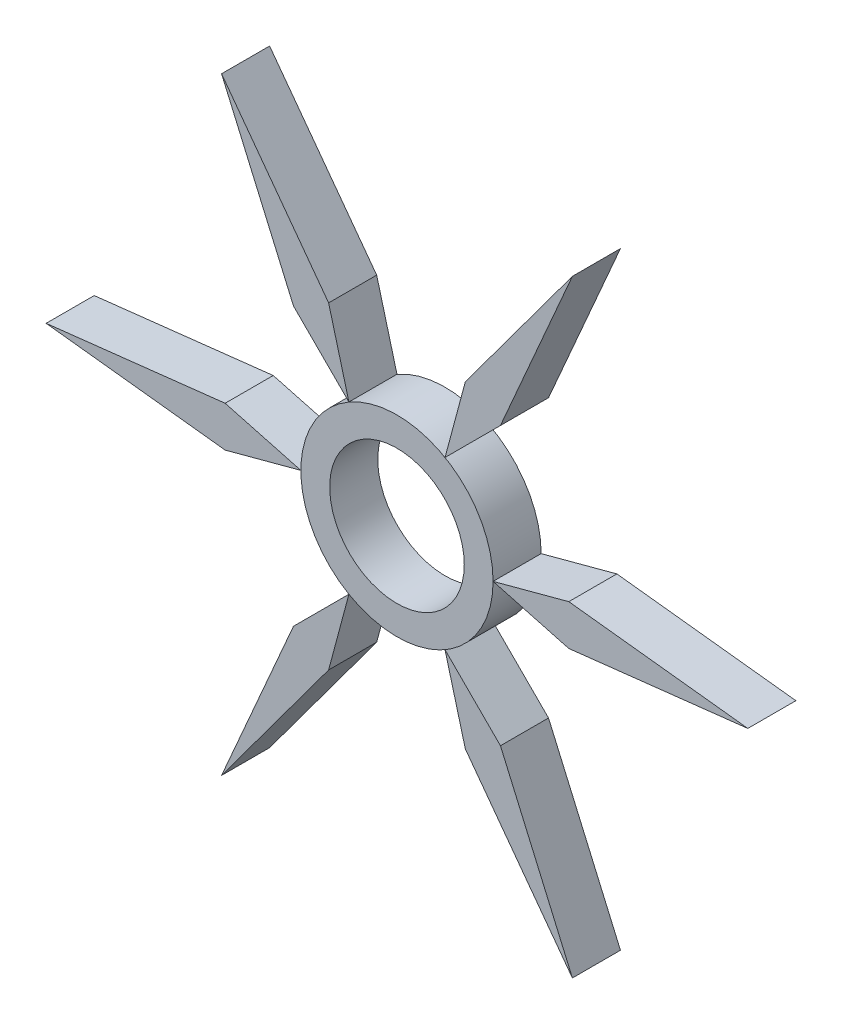
ISO-10303-21;
HEADER;
FILE_DESCRIPTION(('STEP AP214'),'2;1');
FILE_NAME('part.step','',(''),(''),'','','');
FILE_SCHEMA(('AUTOMOTIVE_DESIGN { 1 0 10303 214 1 1 1 1 }'));
ENDSEC;
DATA;
#1=APPLICATION_CONTEXT('core data for automotive mechanical design processes');
#2=APPLICATION_PROTOCOL_DEFINITION('international standard','automotive_design',2000,#1);
#3=PRODUCT_CONTEXT('',#1,'mechanical');
#4=PRODUCT('Part','Part','',(#3));
#5=PRODUCT_RELATED_PRODUCT_CATEGORY('part','',(#4));
#6=PRODUCT_DEFINITION_FORMATION('','',#4);
#7=PRODUCT_DEFINITION_CONTEXT('part definition',#1,'design');
#8=PRODUCT_DEFINITION('design','',#6,#7);
#9=PRODUCT_DEFINITION_SHAPE('','',#8);
#10=(LENGTH_UNIT() NAMED_UNIT(*) SI_UNIT(.MILLI.,.METRE.));
#11=(NAMED_UNIT(*) PLANE_ANGLE_UNIT() SI_UNIT($,.RADIAN.));
#12=(NAMED_UNIT(*) SI_UNIT($,.STERADIAN.) SOLID_ANGLE_UNIT());
#13=UNCERTAINTY_MEASURE_WITH_UNIT(LENGTH_MEASURE(1.E-05),#10,'distance_accuracy_value','');
#14=(GEOMETRIC_REPRESENTATION_CONTEXT(3) GLOBAL_UNCERTAINTY_ASSIGNED_CONTEXT((#13)) GLOBAL_UNIT_ASSIGNED_CONTEXT((#10,
#11,#12)) REPRESENTATION_CONTEXT('',''));
#15=CARTESIAN_POINT('',(0.,0.,0.));
#16=DIRECTION('',(0.,0.,1.));
#17=DIRECTION('',(1.,0.,0.));
#18=AXIS2_PLACEMENT_3D('',#15,#16,#17);
#19=CARTESIAN_POINT('',(-5.00000000000001,1.33974596215564,5.));
#20=DIRECTION('',(0.965925826289067,-0.258819045102524,0.));
#21=DIRECTION('',(0.258819045102524,0.965925826289067,0.));
#22=AXIS2_PLACEMENT_3D('',#19,#20,#21);
#23=PLANE('',#22);
#24=DIRECTION('',(-0.258819045102524,-0.965925826289067,0.));
#25=VECTOR('',#24,1.);
#26=CARTESIAN_POINT('',(-5.00000000000001,1.33974596215564,-5.));
#27=LINE('',#26,#25);
#28=CARTESIAN_POINT('',(-10.0000000000001,-17.3205080756887,-5.));
#29=VERTEX_POINT('',#28);
#30=CARTESIAN_POINT('',(-14.2206626174356,-33.0722354055644,-5.));
#31=VERTEX_POINT('',#30);
#32=EDGE_CURVE('E13',#29,#31,#27,.T.);
#33=ORIENTED_EDGE('',*,*,#32,.F.);
#34=DIRECTION('',(0.,0.,-1.));
#35=VECTOR('',#34,1.);
#36=CARTESIAN_POINT('',(-10.0000000000001,-17.3205080756887,5.));
#37=LINE('',#36,#35);
#38=CARTESIAN_POINT('',(-10.0000000000001,-17.3205080756887,5.));
#39=VERTEX_POINT('',#38);
#40=EDGE_CURVE('E133',#39,#29,#37,.T.);
#41=ORIENTED_EDGE('',*,*,#40,.F.);
#42=DIRECTION('',(-0.258819045102524,-0.965925826289067,0.));
#43=VECTOR('',#42,1.);
#44=CARTESIAN_POINT('',(-5.00000000000001,1.33974596215564,5.));
#45=LINE('',#44,#43);
#46=CARTESIAN_POINT('',(-14.2206626174356,-33.0722354055644,5.));
#47=VERTEX_POINT('',#46);
#48=EDGE_CURVE('E191',#39,#47,#45,.T.);
#49=ORIENTED_EDGE('',*,*,#48,.T.);
#50=DIRECTION('',(0.,0.,-1.));
#51=VECTOR('',#50,1.);
#52=CARTESIAN_POINT('',(-14.2206626174356,-33.0722354055644,5.));
#53=LINE('',#52,#51);
#54=EDGE_CURVE('E173',#47,#31,#53,.T.);
#55=ORIENTED_EDGE('',*,*,#54,.T.);
#56=EDGE_LOOP('',(#33,#41,#49,#55));
#57=FACE_BOUND('',#56,.T.);
#58=ADVANCED_FACE('F129',(#57),#23,.T.);
#59=CARTESIAN_POINT('',(3.66025403784438,-3.66025403784442,5.));
#60=DIRECTION('',(0.707106781186544,-0.707106781186552,0.));
#61=DIRECTION('',(0.707106781186551,0.707106781186544,0.));
#62=AXIS2_PLACEMENT_3D('',#59,#60,#61);
#63=PLANE('',#62);
#64=DIRECTION('',(-0.707106781186552,-0.707106781186544,0.));
#65=VECTOR('',#64,1.);
#66=CARTESIAN_POINT('',(3.66025403784438,-3.66025403784442,-5.));
#67=LINE('',#66,#65);
#68=CARTESIAN_POINT('',(-21.5310647124404,-28.851572788129,-5.));
#69=VERTEX_POINT('',#68);
#70=EDGE_CURVE('E139',#29,#69,#67,.T.);
#71=ORIENTED_EDGE('',*,*,#70,.T.);
#72=DIRECTION('',(0.,0.,-1.));
#73=VECTOR('',#72,1.);
#74=CARTESIAN_POINT('',(-21.5310647124404,-28.851572788129,5.));
#75=LINE('',#74,#73);
#76=CARTESIAN_POINT('',(-21.5310647124404,-28.851572788129,5.));
#77=VERTEX_POINT('',#76);
#78=EDGE_CURVE('E171',#77,#69,#75,.T.);
#79=ORIENTED_EDGE('',*,*,#78,.F.);
#80=DIRECTION('',(-0.707106781186552,-0.707106781186544,0.));
#81=VECTOR('',#80,1.);
#82=CARTESIAN_POINT('',(3.66025403784438,-3.66025403784442,5.));
#83=LINE('',#82,#81);
#84=EDGE_CURVE('E170',#39,#77,#83,.T.);
#85=ORIENTED_EDGE('',*,*,#84,.F.);
#86=ORIENTED_EDGE('',*,*,#40,.T.);
#87=EDGE_LOOP('',(#71,#79,#85,#86));
#88=FACE_BOUND('',#87,.T.);
#89=ADVANCED_FACE('F169',(#88),#63,.F.);
#90=CARTESIAN_POINT('',(-7.53543625072196,3.28202202903648,5.));
#91=DIRECTION('',(0.916814262260015,-0.399313922267461,0.));
#92=DIRECTION('',(0.399313922267461,0.916814262260015,0.));
#93=AXIS2_PLACEMENT_3D('',#90,#91,#92);
#94=PLANE('',#93);
#95=DIRECTION('',(-0.399313922267461,-0.916814262260015,0.));
#96=VECTOR('',#95,1.);
#97=CARTESIAN_POINT('',(-7.53543625072196,3.28202202903648,-5.));
#98=LINE('',#97,#96);
#99=CARTESIAN_POINT('',(-36.5000000000003,-63.2198544762639,-5.));
#100=VERTEX_POINT('',#99);
#101=EDGE_CURVE('E180',#69,#100,#98,.T.);
#102=ORIENTED_EDGE('',*,*,#101,.T.);
#103=DIRECTION('',(0.,0.,-1.));
#104=VECTOR('',#103,1.);
#105=CARTESIAN_POINT('',(-36.5000000000003,-63.2198544762639,5.));
#106=LINE('',#105,#104);
#107=CARTESIAN_POINT('',(-36.5000000000003,-63.2198544762639,5.));
#108=VERTEX_POINT('',#107);
#109=EDGE_CURVE('E195',#108,#100,#106,.T.);
#110=ORIENTED_EDGE('',*,*,#109,.F.);
#111=DIRECTION('',(-0.399313922267461,-0.916814262260015,0.));
#112=VECTOR('',#111,1.);
#113=CARTESIAN_POINT('',(-7.53543625072196,3.28202202903648,5.));
#114=LINE('',#113,#112);
#115=EDGE_CURVE('E189',#77,#108,#114,.T.);
#116=ORIENTED_EDGE('',*,*,#115,.F.);
#117=ORIENTED_EDGE('',*,*,#78,.T.);
#118=EDGE_LOOP('',(#102,#110,#116,#117));
#119=FACE_BOUND('',#118,.T.);
#120=ADVANCED_FACE('F199',(#119),#94,.F.);
#121=CARTESIAN_POINT('',(6.61003257828668,-4.88486820720521,5.));
#122=DIRECTION('',(0.804223131898428,-0.594327480535339,0.));
#123=DIRECTION('',(0.594327480535339,0.804223131898428,0.));
#124=AXIS2_PLACEMENT_3D('',#121,#122,#123);
#125=PLANE('',#124);
#126=DIRECTION('',(-0.594327480535339,-0.804223131898428,0.));
#127=VECTOR('',#126,1.);
#128=CARTESIAN_POINT('',(6.61003257828668,-4.88486820720521,-5.));
#129=LINE('',#128,#127);
#130=EDGE_CURVE('E182',#31,#100,#129,.T.);
#131=ORIENTED_EDGE('',*,*,#130,.F.);
#132=ORIENTED_EDGE('',*,*,#54,.F.);
#133=DIRECTION('',(-0.594327480535339,-0.804223131898428,0.));
#134=VECTOR('',#133,1.);
#135=CARTESIAN_POINT('',(6.61003257828668,-4.88486820720521,5.));
#136=LINE('',#135,#134);
#137=EDGE_CURVE('E186',#47,#108,#136,.T.);
#138=ORIENTED_EDGE('',*,*,#137,.T.);
#139=ORIENTED_EDGE('',*,*,#109,.T.);
#140=EDGE_LOOP('',(#131,#132,#138,#139));
#141=FACE_BOUND('',#140,.T.);
#142=ADVANCED_FACE('F203',(#141),#125,.T.);
#143=CARTESIAN_POINT('',(0.,0.,5.));
#144=DIRECTION('',(0.,0.,1.));
#145=DIRECTION('',(1.,0.,0.));
#146=AXIS2_PLACEMENT_3D('',#143,#144,#145);
#147=PLANE('',#146);
#148=ORIENTED_EDGE('',*,*,#48,.F.);
#149=ORIENTED_EDGE('',*,*,#84,.T.);
#150=ORIENTED_EDGE('',*,*,#115,.T.);
#151=ORIENTED_EDGE('',*,*,#137,.F.);
#152=EDGE_LOOP('',(#148,#149,#150,#151));
#153=FACE_BOUND('',#152,.T.);
#154=ADVANCED_FACE('F131',(#153),#147,.T.);
#155=CARTESIAN_POINT('',(0.,0.,-5.));
#156=DIRECTION('',(0.,0.,1.));
#157=DIRECTION('',(1.,0.,0.));
#158=AXIS2_PLACEMENT_3D('',#155,#156,#157);
#159=PLANE('',#158);
#160=ORIENTED_EDGE('',*,*,#32,.T.);
#161=ORIENTED_EDGE('',*,*,#130,.T.);
#162=ORIENTED_EDGE('',*,*,#101,.F.);
#163=ORIENTED_EDGE('',*,*,#70,.F.);
#164=EDGE_LOOP('',(#160,#161,#162,#163));
#165=FACE_BOUND('',#164,.T.);
#166=ADVANCED_FACE('F178',(#165),#159,.F.);
#167=CLOSED_SHELL('',(#58,#89,#120,#142,#154,#166));
#168=MANIFOLD_SOLID_BREP('B2',#167);
#169=CARTESIAN_POINT('',(10.0000000000002,17.3205080756887,5.));
#170=DIRECTION('',(-0.707106781186539,0.707106781186556,0.));
#171=DIRECTION('',(-0.707106781186556,-0.707106781186539,0.));
#172=AXIS2_PLACEMENT_3D('',#169,#170,#171);
#173=PLANE('',#172);
#174=DIRECTION('',(0.707106781186556,0.707106781186539,0.));
#175=VECTOR('',#174,1.);
#176=CARTESIAN_POINT('',(10.0000000000002,17.3205080756887,-5.));
#177=LINE('',#176,#175);
#178=CARTESIAN_POINT('',(10.0000000000002,17.3205080756887,-5.));
#179=VERTEX_POINT('',#178);
#180=CARTESIAN_POINT('',(21.5310647124406,28.8515727881288,-5.));
#181=VERTEX_POINT('',#180);
#182=EDGE_CURVE('E127',#179,#181,#177,.T.);
#183=ORIENTED_EDGE('',*,*,#182,.T.);
#184=DIRECTION('',(0.,0.,-1.));
#185=VECTOR('',#184,1.);
#186=CARTESIAN_POINT('',(21.5310647124406,28.8515727881288,5.));
#187=LINE('',#186,#185);
#188=CARTESIAN_POINT('',(21.5310647124406,28.8515727881288,5.));
#189=VERTEX_POINT('',#188);
#190=EDGE_CURVE('E318',#189,#181,#187,.T.);
#191=ORIENTED_EDGE('',*,*,#190,.F.);
#192=DIRECTION('',(0.707106781186556,0.707106781186539,0.));
#193=VECTOR('',#192,1.);
#194=CARTESIAN_POINT('',(10.0000000000002,17.3205080756887,5.));
#195=LINE('',#194,#193);
#196=CARTESIAN_POINT('',(10.0000000000002,17.3205080756887,5.));
#197=VERTEX_POINT('',#196);
#198=EDGE_CURVE('E317',#197,#189,#195,.T.);
#199=ORIENTED_EDGE('',*,*,#198,.F.);
#200=DIRECTION('',(0.,0.,-1.));
#201=VECTOR('',#200,1.);
#202=CARTESIAN_POINT('',(10.0000000000002,17.3205080756887,5.));
#203=LINE('',#202,#201);
#204=EDGE_CURVE('E277',#197,#179,#203,.T.);
#205=ORIENTED_EDGE('',*,*,#204,.T.);
#206=EDGE_LOOP('',(#183,#191,#199,#205));
#207=FACE_BOUND('',#206,.T.);
#208=ADVANCED_FACE('F273',(#207),#173,.F.);
#209=CARTESIAN_POINT('',(21.5310647124406,28.8515727881288,5.));
#210=DIRECTION('',(-0.916814262260013,0.399313922267468,0.));
#211=DIRECTION('',(-0.399313922267468,-0.916814262260013,0.));
#212=AXIS2_PLACEMENT_3D('',#209,#210,#211);
#213=PLANE('',#212);
#214=DIRECTION('',(0.399313922267468,0.916814262260012,0.));
#215=VECTOR('',#214,1.);
#216=CARTESIAN_POINT('',(21.5310647124406,28.8515727881288,-5.));
#217=LINE('',#216,#215);
#218=CARTESIAN_POINT('',(36.5000000000007,63.2198544762636,-5.));
#219=VERTEX_POINT('',#218);
#220=EDGE_CURVE('E283',#181,#219,#217,.T.);
#221=ORIENTED_EDGE('',*,*,#220,.T.);
#222=DIRECTION('',(0.,0.,-1.));
#223=VECTOR('',#222,1.);
#224=CARTESIAN_POINT('',(36.5000000000007,63.2198544762636,5.));
#225=LINE('',#224,#223);
#226=CARTESIAN_POINT('',(36.5000000000007,63.2198544762636,5.));
#227=VERTEX_POINT('',#226);
#228=EDGE_CURVE('E392',#227,#219,#225,.T.);
#229=ORIENTED_EDGE('',*,*,#228,.F.);
#230=DIRECTION('',(0.399313922267468,0.916814262260012,0.));
#231=VECTOR('',#230,1.);
#232=CARTESIAN_POINT('',(21.5310647124406,28.8515727881288,5.));
#233=LINE('',#232,#231);
#234=EDGE_CURVE('E402',#189,#227,#233,.T.);
#235=ORIENTED_EDGE('',*,*,#234,.F.);
#236=ORIENTED_EDGE('',*,*,#190,.T.);
#237=EDGE_LOOP('',(#221,#229,#235,#236));
#238=FACE_BOUND('',#237,.T.);
#239=ADVANCED_FACE('F339',(#238),#213,.F.);
#240=CARTESIAN_POINT('',(14.2206626174358,33.0722354055643,5.));
#241=DIRECTION('',(-0.804223131898424,0.594327480535345,0.));
#242=DIRECTION('',(-0.594327480535345,-0.804223131898424,0.));
#243=AXIS2_PLACEMENT_3D('',#240,#241,#242);
#244=PLANE('',#243);
#245=DIRECTION('',(0.594327480535345,0.804223131898424,0.));
#246=VECTOR('',#245,1.);
#247=CARTESIAN_POINT('',(14.2206626174358,33.0722354055643,-5.));
#248=LINE('',#247,#246);
#249=CARTESIAN_POINT('',(14.2206626174358,33.0722354055643,-5.));
#250=VERTEX_POINT('',#249);
#251=EDGE_CURVE('E325',#250,#219,#248,.T.);
#252=ORIENTED_EDGE('',*,*,#251,.F.);
#253=DIRECTION('',(0.,0.,-1.));
#254=VECTOR('',#253,1.);
#255=CARTESIAN_POINT('',(14.2206626174358,33.0722354055643,5.));
#256=LINE('',#255,#254);
#257=CARTESIAN_POINT('',(14.2206626174358,33.0722354055643,5.));
#258=VERTEX_POINT('',#257);
#259=EDGE_CURVE('E323',#258,#250,#256,.T.);
#260=ORIENTED_EDGE('',*,*,#259,.F.);
#261=DIRECTION('',(0.594327480535345,0.804223131898424,0.));
#262=VECTOR('',#261,1.);
#263=CARTESIAN_POINT('',(14.2206626174358,33.0722354055643,5.));
#264=LINE('',#263,#262);
#265=EDGE_CURVE('E400',#258,#227,#264,.T.);
#266=ORIENTED_EDGE('',*,*,#265,.T.);
#267=ORIENTED_EDGE('',*,*,#228,.T.);
#268=EDGE_LOOP('',(#252,#260,#266,#267));
#269=FACE_BOUND('',#268,.T.);
#270=ADVANCED_FACE('F336',(#269),#244,.T.);
#271=CARTESIAN_POINT('',(10.0000000000002,17.3205080756887,5.));
#272=DIRECTION('',(-0.965925826289066,0.258819045102531,0.));
#273=DIRECTION('',(-0.258819045102531,-0.965925826289066,0.));
#274=AXIS2_PLACEMENT_3D('',#271,#272,#273);
#275=PLANE('',#274);
#276=DIRECTION('',(0.258819045102531,0.965925826289065,0.));
#277=VECTOR('',#276,1.);
#278=CARTESIAN_POINT('',(10.0000000000002,17.3205080756887,-5.));
#279=LINE('',#278,#277);
#280=EDGE_CURVE('E321',#179,#250,#279,.T.);
#281=ORIENTED_EDGE('',*,*,#280,.F.);
#282=ORIENTED_EDGE('',*,*,#204,.F.);
#283=DIRECTION('',(0.258819045102531,0.965925826289065,0.));
#284=VECTOR('',#283,1.);
#285=CARTESIAN_POINT('',(10.0000000000002,17.3205080756887,5.));
#286=LINE('',#285,#284);
#287=EDGE_CURVE('E398',#197,#258,#286,.T.);
#288=ORIENTED_EDGE('',*,*,#287,.T.);
#289=ORIENTED_EDGE('',*,*,#259,.T.);
#290=EDGE_LOOP('',(#281,#282,#288,#289));
#291=FACE_BOUND('',#290,.T.);
#292=ADVANCED_FACE('F322',(#291),#275,.T.);
#293=CARTESIAN_POINT('',(0.,0.,5.));
#294=DIRECTION('',(0.,0.,1.));
#295=DIRECTION('',(1.,0.,0.));
#296=AXIS2_PLACEMENT_3D('',#293,#294,#295);
#297=PLANE('',#296);
#298=ORIENTED_EDGE('',*,*,#198,.T.);
#299=ORIENTED_EDGE('',*,*,#234,.T.);
#300=ORIENTED_EDGE('',*,*,#265,.F.);
#301=ORIENTED_EDGE('',*,*,#287,.F.);
#302=EDGE_LOOP('',(#298,#299,#300,#301));
#303=FACE_BOUND('',#302,.T.);
#304=ADVANCED_FACE('F275',(#303),#297,.T.);
#305=CARTESIAN_POINT('',(0.,0.,-5.));
#306=DIRECTION('',(0.,0.,1.));
#307=DIRECTION('',(1.,0.,0.));
#308=AXIS2_PLACEMENT_3D('',#305,#306,#307);
#309=PLANE('',#308);
#310=ORIENTED_EDGE('',*,*,#182,.F.);
#311=ORIENTED_EDGE('',*,*,#280,.T.);
#312=ORIENTED_EDGE('',*,*,#251,.T.);
#313=ORIENTED_EDGE('',*,*,#220,.F.);
#314=EDGE_LOOP('',(#310,#311,#312,#313));
#315=FACE_BOUND('',#314,.T.);
#316=ADVANCED_FACE('F327',(#315),#309,.F.);
#317=CLOSED_SHELL('',(#208,#239,#270,#292,#304,#316));
#318=MANIFOLD_SOLID_BREP('B7',#317);
#319=CARTESIAN_POINT('',(0.,0.,5.));
#320=DIRECTION('',(0.,0.,-1.));
#321=DIRECTION('',(-1.,0.,0.));
#322=AXIS2_PLACEMENT_3D('',#319,#320,#321);
#323=CYLINDRICAL_SURFACE('',#322,20.);
#324=CARTESIAN_POINT('',(0.,0.,-5.));
#325=DIRECTION('',(0.,0.,1.));
#326=DIRECTION('',(1.,0.,0.));
#327=AXIS2_PLACEMENT_3D('',#324,#325,#326);
#328=CIRCLE('',#327,20.);
#329=CARTESIAN_POINT('',(20.,0.,-5.));
#330=VERTEX_POINT('',#329);
#331=EDGE_CURVE('E428',#330,#330,#328,.T.);
#332=ORIENTED_EDGE('',*,*,#331,.T.);
#333=EDGE_LOOP('',(#332));
#334=FACE_BOUND('',#333,.T.);
#335=CARTESIAN_POINT('',(0.,0.,5.));
#336=DIRECTION('',(0.,0.,1.));
#337=DIRECTION('',(1.,0.,0.));
#338=AXIS2_PLACEMENT_3D('',#335,#336,#337);
#339=CIRCLE('',#338,20.);
#340=CARTESIAN_POINT('',(20.,0.,5.));
#341=VERTEX_POINT('',#340);
#342=EDGE_CURVE('E435',#341,#341,#339,.T.);
#343=ORIENTED_EDGE('',*,*,#342,.F.);
#344=EDGE_LOOP('',(#343));
#345=FACE_BOUND('',#344,.T.);
#346=ADVANCED_FACE('F419',(#334,#345),#323,.T.);
#347=CARTESIAN_POINT('',(0.,0.,5.));
#348=DIRECTION('',(0.,0.,-1.));
#349=DIRECTION('',(-1.,0.,0.));
#350=AXIS2_PLACEMENT_3D('',#347,#348,#349);
#351=CYLINDRICAL_SURFACE('',#350,14.);
#352=CARTESIAN_POINT('',(0.,0.,5.));
#353=DIRECTION('',(0.,0.,1.));
#354=DIRECTION('',(1.,0.,0.));
#355=AXIS2_PLACEMENT_3D('',#352,#353,#354);
#356=CIRCLE('',#355,14.);
#357=CARTESIAN_POINT('',(14.,0.,5.));
#358=VERTEX_POINT('',#357);
#359=EDGE_CURVE('E423',#358,#358,#356,.T.);
#360=ORIENTED_EDGE('',*,*,#359,.T.);
#361=EDGE_LOOP('',(#360));
#362=FACE_BOUND('',#361,.T.);
#363=CARTESIAN_POINT('',(0.,0.,-5.));
#364=DIRECTION('',(0.,0.,1.));
#365=DIRECTION('',(1.,0.,0.));
#366=AXIS2_PLACEMENT_3D('',#363,#364,#365);
#367=CIRCLE('',#366,14.);
#368=CARTESIAN_POINT('',(14.,0.,-5.));
#369=VERTEX_POINT('',#368);
#370=EDGE_CURVE('E272',#369,#369,#367,.T.);
#371=ORIENTED_EDGE('',*,*,#370,.F.);
#372=EDGE_LOOP('',(#371));
#373=FACE_BOUND('',#372,.T.);
#374=ADVANCED_FACE('F444',(#362,#373),#351,.F.);
#375=CARTESIAN_POINT('',(0.,0.,5.));
#376=DIRECTION('',(0.,0.,1.));
#377=DIRECTION('',(1.,0.,0.));
#378=AXIS2_PLACEMENT_3D('',#375,#376,#377);
#379=PLANE('',#378);
#380=ORIENTED_EDGE('',*,*,#359,.F.);
#381=EDGE_LOOP('',(#380));
#382=FACE_BOUND('',#381,.T.);
#383=ORIENTED_EDGE('',*,*,#342,.T.);
#384=EDGE_LOOP('',(#383));
#385=FACE_BOUND('',#384,.T.);
#386=ADVANCED_FACE('F421',(#382,#385),#379,.T.);
#387=CARTESIAN_POINT('',(0.,0.,-5.));
#388=DIRECTION('',(0.,0.,1.));
#389=DIRECTION('',(1.,0.,0.));
#390=AXIS2_PLACEMENT_3D('',#387,#388,#389);
#391=PLANE('',#390);
#392=ORIENTED_EDGE('',*,*,#370,.T.);
#393=EDGE_LOOP('',(#392));
#394=FACE_BOUND('',#393,.T.);
#395=ORIENTED_EDGE('',*,*,#331,.F.);
#396=EDGE_LOOP('',(#395));
#397=FACE_BOUND('',#396,.T.);
#398=ADVANCED_FACE('F448',(#394,#397),#391,.F.);
#399=CLOSED_SHELL('',(#346,#374,#386,#398));
#400=MANIFOLD_SOLID_BREP('B121',#399);
#401=CARTESIAN_POINT('',(20.,0.,5.));
#402=DIRECTION('',(-0.258819045102522,0.965925826289068,0.));
#403=DIRECTION('',(-0.965925826289068,-0.258819045102522,0.));
#404=AXIS2_PLACEMENT_3D('',#401,#402,#403);
#405=PLANE('',#404);
#406=DIRECTION('',(0.965925826289068,0.258819045102522,0.));
#407=VECTOR('',#406,1.);
#408=CARTESIAN_POINT('',(20.,0.,-5.));
#409=LINE('',#408,#407);
#410=CARTESIAN_POINT('',(20.,0.,-5.));
#411=VERTEX_POINT('',#410);
#412=CARTESIAN_POINT('',(35.7517273298757,4.22066261743546,-5.));
#413=VERTEX_POINT('',#412);
#414=EDGE_CURVE('E417',#411,#413,#409,.T.);
#415=ORIENTED_EDGE('',*,*,#414,.F.);
#416=DIRECTION('',(0.,0.,-1.));
#417=VECTOR('',#416,1.);
#418=CARTESIAN_POINT('',(20.,0.,5.));
#419=LINE('',#418,#417);
#420=CARTESIAN_POINT('',(20.,0.,5.));
#421=VERTEX_POINT('',#420);
#422=EDGE_CURVE('E507',#421,#411,#419,.T.);
#423=ORIENTED_EDGE('',*,*,#422,.F.);
#424=DIRECTION('',(0.965925826289068,0.258819045102522,0.));
#425=VECTOR('',#424,1.);
#426=CARTESIAN_POINT('',(20.,0.,5.));
#427=LINE('',#426,#425);
#428=CARTESIAN_POINT('',(35.7517273298757,4.22066261743546,5.));
#429=VERTEX_POINT('',#428);
#430=EDGE_CURVE('E556',#421,#429,#427,.T.);
#431=ORIENTED_EDGE('',*,*,#430,.T.);
#432=DIRECTION('',(0.,0.,-1.));
#433=VECTOR('',#432,1.);
#434=CARTESIAN_POINT('',(35.7517273298757,4.22066261743546,5.));
#435=LINE('',#434,#433);
#436=EDGE_CURVE('E522',#429,#413,#435,.T.);
#437=ORIENTED_EDGE('',*,*,#436,.T.);
#438=EDGE_LOOP('',(#415,#423,#431,#437));
#439=FACE_BOUND('',#438,.T.);
#440=ADVANCED_FACE('F503',(#439),#405,.T.);
#441=CARTESIAN_POINT('',(20.,0.,5.));
#442=DIRECTION('',(0.258819045102522,0.965925826289068,0.));
#443=DIRECTION('',(-0.965925826289068,0.258819045102522,0.));
#444=AXIS2_PLACEMENT_3D('',#441,#442,#443);
#445=PLANE('',#444);
#446=DIRECTION('',(0.965925826289068,-0.258819045102522,0.));
#447=VECTOR('',#446,1.);
#448=CARTESIAN_POINT('',(20.,0.,-5.));
#449=LINE('',#448,#447);
#450=CARTESIAN_POINT('',(35.7517273298757,-4.22066261743546,-5.));
#451=VERTEX_POINT('',#450);
#452=EDGE_CURVE('E546',#411,#451,#449,.T.);
#453=ORIENTED_EDGE('',*,*,#452,.T.);
#454=DIRECTION('',(0.,0.,-1.));
#455=VECTOR('',#454,1.);
#456=CARTESIAN_POINT('',(35.7517273298757,-4.22066261743546,5.));
#457=LINE('',#456,#455);
#458=CARTESIAN_POINT('',(35.7517273298757,-4.22066261743546,5.));
#459=VERTEX_POINT('',#458);
#460=EDGE_CURVE('E549',#459,#451,#457,.T.);
#461=ORIENTED_EDGE('',*,*,#460,.F.);
#462=DIRECTION('',(0.965925826289068,-0.258819045102522,0.));
#463=VECTOR('',#462,1.);
#464=CARTESIAN_POINT('',(20.,0.,5.));
#465=LINE('',#464,#463);
#466=EDGE_CURVE('E548',#421,#459,#465,.T.);
#467=ORIENTED_EDGE('',*,*,#466,.F.);
#468=ORIENTED_EDGE('',*,*,#422,.T.);
#469=EDGE_LOOP('',(#453,#461,#467,#468));
#470=FACE_BOUND('',#469,.T.);
#471=ADVANCED_FACE('F543',(#470),#445,.F.);
#472=CARTESIAN_POINT('',(35.7517273298757,-4.22066261743546,5.));
#473=DIRECTION('',(-0.112591130361586,0.993641402802792,0.));
#474=DIRECTION('',(-0.993641402802792,-0.112591130361586,0.));
#475=AXIS2_PLACEMENT_3D('',#472,#473,#474);
#476=PLANE('',#475);
#477=DIRECTION('',(0.993641402802792,0.112591130361586,0.));
#478=VECTOR('',#477,1.);
#479=CARTESIAN_POINT('',(35.7517273298757,-4.22066261743546,-5.));
#480=LINE('',#479,#478);
#481=CARTESIAN_POINT('',(73.,0.,-5.));
#482=VERTEX_POINT('',#481);
#483=EDGE_CURVE('E555',#451,#482,#480,.T.);
#484=ORIENTED_EDGE('',*,*,#483,.T.);
#485=DIRECTION('',(0.,0.,-1.));
#486=VECTOR('',#485,1.);
#487=CARTESIAN_POINT('',(73.,0.,5.));
#488=LINE('',#487,#486);
#489=CARTESIAN_POINT('',(73.,0.,5.));
#490=VERTEX_POINT('',#489);
#491=EDGE_CURVE('E572',#490,#482,#488,.T.);
#492=ORIENTED_EDGE('',*,*,#491,.F.);
#493=DIRECTION('',(0.993641402802792,0.112591130361586,0.));
#494=VECTOR('',#493,1.);
#495=CARTESIAN_POINT('',(35.7517273298757,-4.22066261743546,5.));
#496=LINE('',#495,#494);
#497=EDGE_CURVE('E565',#459,#490,#496,.T.);
#498=ORIENTED_EDGE('',*,*,#497,.F.);
#499=ORIENTED_EDGE('',*,*,#460,.T.);
#500=EDGE_LOOP('',(#484,#492,#498,#499));
#501=FACE_BOUND('',#500,.T.);
#502=ADVANCED_FACE('F576',(#501),#476,.F.);
#503=CARTESIAN_POINT('',(35.7517273298757,4.22066261743546,5.));
#504=DIRECTION('',(0.112591130361586,0.993641402802792,0.));
#505=DIRECTION('',(-0.993641402802792,0.112591130361586,0.));
#506=AXIS2_PLACEMENT_3D('',#503,#504,#505);
#507=PLANE('',#506);
#508=DIRECTION('',(0.993641402802792,-0.112591130361586,0.));
#509=VECTOR('',#508,1.);
#510=CARTESIAN_POINT('',(35.7517273298757,4.22066261743546,-5.));
#511=LINE('',#510,#509);
#512=EDGE_CURVE('E513',#413,#482,#511,.T.);
#513=ORIENTED_EDGE('',*,*,#512,.F.);
#514=ORIENTED_EDGE('',*,*,#436,.F.);
#515=DIRECTION('',(0.993641402802792,-0.112591130361586,0.));
#516=VECTOR('',#515,1.);
#517=CARTESIAN_POINT('',(35.7517273298757,4.22066261743546,5.));
#518=LINE('',#517,#516);
#519=EDGE_CURVE('E559',#429,#490,#518,.T.);
#520=ORIENTED_EDGE('',*,*,#519,.T.);
#521=ORIENTED_EDGE('',*,*,#491,.T.);
#522=EDGE_LOOP('',(#513,#514,#520,#521));
#523=FACE_BOUND('',#522,.T.);
#524=ADVANCED_FACE('F570',(#523),#507,.T.);
#525=CARTESIAN_POINT('',(0.,0.,5.));
#526=DIRECTION('',(0.,0.,-1.));
#527=DIRECTION('',(-1.,0.,0.));
#528=AXIS2_PLACEMENT_3D('',#525,#526,#527);
#529=PLANE('',#528);
#530=ORIENTED_EDGE('',*,*,#430,.F.);
#531=ORIENTED_EDGE('',*,*,#466,.T.);
#532=ORIENTED_EDGE('',*,*,#497,.T.);
#533=ORIENTED_EDGE('',*,*,#519,.F.);
#534=EDGE_LOOP('',(#530,#531,#532,#533));
#535=FACE_BOUND('',#534,.T.);
#536=ADVANCED_FACE('F505',(#535),#529,.F.);
#537=CARTESIAN_POINT('',(0.,0.,-5.));
#538=DIRECTION('',(0.,0.,-1.));
#539=DIRECTION('',(-1.,0.,0.));
#540=AXIS2_PLACEMENT_3D('',#537,#538,#539);
#541=PLANE('',#540);
#542=ORIENTED_EDGE('',*,*,#414,.T.);
#543=ORIENTED_EDGE('',*,*,#512,.T.);
#544=ORIENTED_EDGE('',*,*,#483,.F.);
#545=ORIENTED_EDGE('',*,*,#452,.F.);
#546=EDGE_LOOP('',(#542,#543,#544,#545));
#547=FACE_BOUND('',#546,.T.);
#548=ADVANCED_FACE('F553',(#547),#541,.T.);
#549=CLOSED_SHELL('',(#440,#471,#502,#524,#536,#548));
#550=MANIFOLD_SOLID_BREP('B267',#549);
#551=CARTESIAN_POINT('',(-20.,1.39659253553725E-13,5.));
#552=DIRECTION('',(-0.258819045102528,-0.965925826289066,0.));
#553=DIRECTION('',(0.965925826289066,-0.258819045102528,0.));
#554=AXIS2_PLACEMENT_3D('',#551,#552,#553);
#555=PLANE('',#554);
#556=DIRECTION('',(-0.965925826289066,0.258819045102528,0.));
#557=VECTOR('',#556,1.);
#558=CARTESIAN_POINT('',(-20.,1.39659253553725E-13,-5.));
#559=LINE('',#558,#557);
#560=CARTESIAN_POINT('',(-20.,1.39645239816133E-13,-5.));
#561=VERTEX_POINT('',#560);
#562=CARTESIAN_POINT('',(-35.7517273298757,4.22066261743571,-5.));
#563=VERTEX_POINT('',#562);
#564=EDGE_CURVE('E501',#561,#563,#559,.T.);
#565=ORIENTED_EDGE('',*,*,#564,.T.);
#566=DIRECTION('',(0.,0.,-1.));
#567=VECTOR('',#566,1.);
#568=CARTESIAN_POINT('',(-35.7517273298757,4.22066261743571,5.));
#569=LINE('',#568,#567);
#570=CARTESIAN_POINT('',(-35.7517273298757,4.22066261743571,5.));
#571=VERTEX_POINT('',#570);
#572=EDGE_CURVE('E694',#571,#563,#569,.T.);
#573=ORIENTED_EDGE('',*,*,#572,.F.);
#574=DIRECTION('',(-0.965925826289066,0.258819045102528,0.));
#575=VECTOR('',#574,1.);
#576=CARTESIAN_POINT('',(-20.,1.39659253553725E-13,5.));
#577=LINE('',#576,#575);
#578=CARTESIAN_POINT('',(-20.,1.39645239816133E-13,5.));
#579=VERTEX_POINT('',#578);
#580=EDGE_CURVE('E693',#579,#571,#577,.T.);
#581=ORIENTED_EDGE('',*,*,#580,.F.);
#582=DIRECTION('',(0.,0.,-1.));
#583=VECTOR('',#582,1.);
#584=CARTESIAN_POINT('',(-20.,1.40512601554121E-13,5.));
#585=LINE('',#584,#583);
#586=EDGE_CURVE('E653',#579,#561,#585,.T.);
#587=ORIENTED_EDGE('',*,*,#586,.T.);
#588=EDGE_LOOP('',(#565,#573,#581,#587));
#589=FACE_BOUND('',#588,.T.);
#590=ADVANCED_FACE('F649',(#589),#555,.F.);
#591=CARTESIAN_POINT('',(-35.7517273298757,4.22066261743571,5.));
#592=DIRECTION('',(0.112591130361579,-0.993641402802793,0.));
#593=DIRECTION('',(0.993641402802793,0.112591130361579,0.));
#594=AXIS2_PLACEMENT_3D('',#591,#592,#593);
#595=PLANE('',#594);
#596=DIRECTION('',(-0.993641402802793,-0.112591130361579,0.));
#597=VECTOR('',#596,1.);
#598=CARTESIAN_POINT('',(-35.7517273298757,4.22066261743571,-5.));
#599=LINE('',#598,#597);
#600=CARTESIAN_POINT('',(-73.,5.09756275471097E-13,-5.));
#601=VERTEX_POINT('',#600);
#602=EDGE_CURVE('E659',#563,#601,#599,.T.);
#603=ORIENTED_EDGE('',*,*,#602,.T.);
#604=DIRECTION('',(0.,0.,-1.));
#605=VECTOR('',#604,1.);
#606=CARTESIAN_POINT('',(-73.,5.09756275471097E-13,5.));
#607=LINE('',#606,#605);
#608=CARTESIAN_POINT('',(-73.,5.09756275471097E-13,5.));
#609=VERTEX_POINT('',#608);
#610=EDGE_CURVE('E768',#609,#601,#607,.T.);
#611=ORIENTED_EDGE('',*,*,#610,.F.);
#612=DIRECTION('',(-0.993641402802793,-0.112591130361579,0.));
#613=VECTOR('',#612,1.);
#614=CARTESIAN_POINT('',(-35.7517273298757,4.22066261743571,5.));
#615=LINE('',#614,#613);
#616=EDGE_CURVE('E778',#571,#609,#615,.T.);
#617=ORIENTED_EDGE('',*,*,#616,.F.);
#618=ORIENTED_EDGE('',*,*,#572,.T.);
#619=EDGE_LOOP('',(#603,#611,#617,#618));
#620=FACE_BOUND('',#619,.T.);
#621=ADVANCED_FACE('F715',(#620),#595,.F.);
#622=CARTESIAN_POINT('',(-35.7517273298758,-4.22066261743521,5.));
#623=DIRECTION('',(-0.112591130361593,-0.993641402802791,0.));
#624=DIRECTION('',(0.993641402802791,-0.112591130361593,0.));
#625=AXIS2_PLACEMENT_3D('',#622,#623,#624);
#626=PLANE('',#625);
#627=DIRECTION('',(-0.993641402802791,0.112591130361593,0.));
#628=VECTOR('',#627,1.);
#629=CARTESIAN_POINT('',(-35.7517273298758,-4.22066261743521,-5.));
#630=LINE('',#629,#628);
#631=CARTESIAN_POINT('',(-35.7517273298758,-4.22066261743521,-5.));
#632=VERTEX_POINT('',#631);
#633=EDGE_CURVE('E701',#632,#601,#630,.T.);
#634=ORIENTED_EDGE('',*,*,#633,.F.);
#635=DIRECTION('',(0.,0.,-1.));
#636=VECTOR('',#635,1.);
#637=CARTESIAN_POINT('',(-35.7517273298758,-4.22066261743521,5.));
#638=LINE('',#637,#636);
#639=CARTESIAN_POINT('',(-35.7517273298758,-4.22066261743521,5.));
#640=VERTEX_POINT('',#639);
#641=EDGE_CURVE('E699',#640,#632,#638,.T.);
#642=ORIENTED_EDGE('',*,*,#641,.F.);
#643=DIRECTION('',(-0.993641402802791,0.112591130361593,0.));
#644=VECTOR('',#643,1.);
#645=CARTESIAN_POINT('',(-35.7517273298758,-4.22066261743521,5.));
#646=LINE('',#645,#644);
#647=EDGE_CURVE('E776',#640,#609,#646,.T.);
#648=ORIENTED_EDGE('',*,*,#647,.T.);
#649=ORIENTED_EDGE('',*,*,#610,.T.);
#650=EDGE_LOOP('',(#634,#642,#648,#649));
#651=FACE_BOUND('',#650,.T.);
#652=ADVANCED_FACE('F712',(#651),#626,.T.);
#653=CARTESIAN_POINT('',(-20.,1.39659253553725E-13,5.));
#654=DIRECTION('',(0.258819045102515,-0.96592582628907,0.));
#655=DIRECTION('',(0.96592582628907,0.258819045102515,0.));
#656=AXIS2_PLACEMENT_3D('',#653,#654,#655);
#657=PLANE('',#656);
#658=DIRECTION('',(-0.96592582628907,-0.258819045102515,0.));
#659=VECTOR('',#658,1.);
#660=CARTESIAN_POINT('',(-20.,1.39659253553725E-13,-5.));
#661=LINE('',#660,#659);
#662=EDGE_CURVE('E697',#561,#632,#661,.T.);
#663=ORIENTED_EDGE('',*,*,#662,.F.);
#664=ORIENTED_EDGE('',*,*,#586,.F.);
#665=DIRECTION('',(-0.96592582628907,-0.258819045102515,0.));
#666=VECTOR('',#665,1.);
#667=CARTESIAN_POINT('',(-20.,1.39659253553725E-13,5.));
#668=LINE('',#667,#666);
#669=EDGE_CURVE('E774',#579,#640,#668,.T.);
#670=ORIENTED_EDGE('',*,*,#669,.T.);
#671=ORIENTED_EDGE('',*,*,#641,.T.);
#672=EDGE_LOOP('',(#663,#664,#670,#671));
#673=FACE_BOUND('',#672,.T.);
#674=ADVANCED_FACE('F698',(#673),#657,.T.);
#675=CARTESIAN_POINT('',(0.,0.,5.));
#676=DIRECTION('',(0.,0.,1.));
#677=DIRECTION('',(1.,0.,0.));
#678=AXIS2_PLACEMENT_3D('',#675,#676,#677);
#679=PLANE('',#678);
#680=ORIENTED_EDGE('',*,*,#580,.T.);
#681=ORIENTED_EDGE('',*,*,#616,.T.);
#682=ORIENTED_EDGE('',*,*,#647,.F.);
#683=ORIENTED_EDGE('',*,*,#669,.F.);
#684=EDGE_LOOP('',(#680,#681,#682,#683));
#685=FACE_BOUND('',#684,.T.);
#686=ADVANCED_FACE('F651',(#685),#679,.T.);
#687=CARTESIAN_POINT('',(0.,0.,-5.));
#688=DIRECTION('',(0.,0.,1.));
#689=DIRECTION('',(1.,0.,0.));
#690=AXIS2_PLACEMENT_3D('',#687,#688,#689);
#691=PLANE('',#690);
#692=ORIENTED_EDGE('',*,*,#564,.F.);
#693=ORIENTED_EDGE('',*,*,#662,.T.);
#694=ORIENTED_EDGE('',*,*,#633,.T.);
#695=ORIENTED_EDGE('',*,*,#602,.F.);
#696=EDGE_LOOP('',(#692,#693,#694,#695));
#697=FACE_BOUND('',#696,.T.);
#698=ADVANCED_FACE('F703',(#697),#691,.F.);
#699=CLOSED_SHELL('',(#590,#621,#652,#674,#686,#698));
#700=MANIFOLD_SOLID_BREP('B411',#699);
#701=CARTESIAN_POINT('',(-9.99999999999984,17.3205080756889,5.));
#702=DIRECTION('',(-0.707106781186553,-0.707106781186542,0.));
#703=DIRECTION('',(0.707106781186542,-0.707106781186553,0.));
#704=AXIS2_PLACEMENT_3D('',#701,#702,#703);
#705=PLANE('',#704);
#706=DIRECTION('',(-0.707106781186542,0.707106781186553,0.));
#707=VECTOR('',#706,1.);
#708=CARTESIAN_POINT('',(-9.99999999999984,17.3205080756889,-5.));
#709=LINE('',#708,#707);
#710=CARTESIAN_POINT('',(-9.99999999999984,17.3205080756889,-5.));
#711=VERTEX_POINT('',#710);
#712=CARTESIAN_POINT('',(-21.53106471244,28.8515727881292,-5.));
#713=VERTEX_POINT('',#712);
#714=EDGE_CURVE('E647',#711,#713,#709,.T.);
#715=ORIENTED_EDGE('',*,*,#714,.F.);
#716=DIRECTION('',(0.,0.,-1.));
#717=VECTOR('',#716,1.);
#718=CARTESIAN_POINT('',(-9.99999999999984,17.3205080756889,5.));
#719=LINE('',#718,#717);
#720=CARTESIAN_POINT('',(-9.99999999999984,17.3205080756889,5.));
#721=VERTEX_POINT('',#720);
#722=EDGE_CURVE('E798',#721,#711,#719,.T.);
#723=ORIENTED_EDGE('',*,*,#722,.F.);
#724=DIRECTION('',(-0.707106781186542,0.707106781186553,0.));
#725=VECTOR('',#724,1.);
#726=CARTESIAN_POINT('',(-9.99999999999984,17.3205080756889,5.));
#727=LINE('',#726,#725);
#728=CARTESIAN_POINT('',(-21.53106471244,28.8515727881292,5.));
#729=VERTEX_POINT('',#728);
#730=EDGE_CURVE('E847',#721,#729,#727,.T.);
#731=ORIENTED_EDGE('',*,*,#730,.T.);
#732=DIRECTION('',(0.,0.,-1.));
#733=VECTOR('',#732,1.);
#734=CARTESIAN_POINT('',(-21.53106471244,28.8515727881292,5.));
#735=LINE('',#734,#733);
#736=EDGE_CURVE('E813',#729,#713,#735,.T.);
#737=ORIENTED_EDGE('',*,*,#736,.T.);
#738=EDGE_LOOP('',(#715,#723,#731,#737));
#739=FACE_BOUND('',#738,.T.);
#740=ADVANCED_FACE('F794',(#739),#705,.T.);
#741=CARTESIAN_POINT('',(-9.99999999999984,17.3205080756889,5.));
#742=DIRECTION('',(-0.965925826289071,-0.258819045102511,0.));
#743=DIRECTION('',(0.258819045102511,-0.965925826289071,0.));
#744=AXIS2_PLACEMENT_3D('',#741,#742,#743);
#745=PLANE('',#744);
#746=DIRECTION('',(-0.258819045102511,0.965925826289071,0.));
#747=VECTOR('',#746,1.);
#748=CARTESIAN_POINT('',(-9.99999999999984,17.3205080756889,-5.));
#749=LINE('',#748,#747);
#750=CARTESIAN_POINT('',(-14.2206626174351,33.0722354055646,-5.));
#751=VERTEX_POINT('',#750);
#752=EDGE_CURVE('E837',#711,#751,#749,.T.);
#753=ORIENTED_EDGE('',*,*,#752,.T.);
#754=DIRECTION('',(0.,0.,-1.));
#755=VECTOR('',#754,1.);
#756=CARTESIAN_POINT('',(-14.2206626174351,33.0722354055646,5.));
#757=LINE('',#756,#755);
#758=CARTESIAN_POINT('',(-14.2206626174351,33.0722354055646,5.));
#759=VERTEX_POINT('',#758);
#760=EDGE_CURVE('E840',#759,#751,#757,.T.);
#761=ORIENTED_EDGE('',*,*,#760,.F.);
#762=DIRECTION('',(-0.258819045102511,0.965925826289071,0.));
#763=VECTOR('',#762,1.);
#764=CARTESIAN_POINT('',(-9.99999999999984,17.3205080756889,5.));
#765=LINE('',#764,#763);
#766=EDGE_CURVE('E839',#721,#759,#765,.T.);
#767=ORIENTED_EDGE('',*,*,#766,.F.);
#768=ORIENTED_EDGE('',*,*,#722,.T.);
#769=EDGE_LOOP('',(#753,#761,#767,#768));
#770=FACE_BOUND('',#769,.T.);
#771=ADVANCED_FACE('F834',(#770),#745,.F.);
#772=CARTESIAN_POINT('',(-14.2206626174351,33.0722354055646,5.));
#773=DIRECTION('',(-0.804223131898436,-0.594327480535328,0.));
#774=DIRECTION('',(0.594327480535328,-0.804223131898437,0.));
#775=AXIS2_PLACEMENT_3D('',#772,#773,#774);
#776=PLANE('',#775);
#777=DIRECTION('',(-0.594327480535328,0.804223131898436,0.));
#778=VECTOR('',#777,1.);
#779=CARTESIAN_POINT('',(-14.2206626174351,33.0722354055646,-5.));
#780=LINE('',#779,#778);
#781=CARTESIAN_POINT('',(-36.4999999999994,63.2198544762644,-5.));
#782=VERTEX_POINT('',#781);
#783=EDGE_CURVE('E846',#751,#782,#780,.T.);
#784=ORIENTED_EDGE('',*,*,#783,.T.);
#785=DIRECTION('',(0.,0.,-1.));
#786=VECTOR('',#785,1.);
#787=CARTESIAN_POINT('',(-36.4999999999994,63.2198544762644,5.));
#788=LINE('',#787,#786);
#789=CARTESIAN_POINT('',(-36.4999999999994,63.2198544762644,5.));
#790=VERTEX_POINT('',#789);
#791=EDGE_CURVE('E863',#790,#782,#788,.T.);
#792=ORIENTED_EDGE('',*,*,#791,.F.);
#793=DIRECTION('',(-0.594327480535328,0.804223131898436,0.));
#794=VECTOR('',#793,1.);
#795=CARTESIAN_POINT('',(-14.2206626174351,33.0722354055646,5.));
#796=LINE('',#795,#794);
#797=EDGE_CURVE('E856',#759,#790,#796,.T.);
#798=ORIENTED_EDGE('',*,*,#797,.F.);
#799=ORIENTED_EDGE('',*,*,#760,.T.);
#800=EDGE_LOOP('',(#784,#792,#798,#799));
#801=FACE_BOUND('',#800,.T.);
#802=ADVANCED_FACE('F867',(#801),#776,.F.);
#803=CARTESIAN_POINT('',(-21.53106471244,28.8515727881292,5.));
#804=DIRECTION('',(-0.916814262260021,-0.399313922267448,0.));
#805=DIRECTION('',(0.399313922267448,-0.916814262260021,0.));
#806=AXIS2_PLACEMENT_3D('',#803,#804,#805);
#807=PLANE('',#806);
#808=DIRECTION('',(-0.399313922267448,0.916814262260021,0.));
#809=VECTOR('',#808,1.);
#810=CARTESIAN_POINT('',(-21.53106471244,28.8515727881292,-5.));
#811=LINE('',#810,#809);
#812=EDGE_CURVE('E804',#713,#782,#811,.T.);
#813=ORIENTED_EDGE('',*,*,#812,.F.);
#814=ORIENTED_EDGE('',*,*,#736,.F.);
#815=DIRECTION('',(-0.399313922267448,0.916814262260021,0.));
#816=VECTOR('',#815,1.);
#817=CARTESIAN_POINT('',(-21.53106471244,28.8515727881292,5.));
#818=LINE('',#817,#816);
#819=EDGE_CURVE('E850',#729,#790,#818,.T.);
#820=ORIENTED_EDGE('',*,*,#819,.T.);
#821=ORIENTED_EDGE('',*,*,#791,.T.);
#822=EDGE_LOOP('',(#813,#814,#820,#821));
#823=FACE_BOUND('',#822,.T.);
#824=ADVANCED_FACE('F861',(#823),#807,.T.);
#825=CARTESIAN_POINT('',(0.,0.,5.));
#826=DIRECTION('',(0.,0.,-1.));
#827=DIRECTION('',(-1.,0.,0.));
#828=AXIS2_PLACEMENT_3D('',#825,#826,#827);
#829=PLANE('',#828);
#830=ORIENTED_EDGE('',*,*,#730,.F.);
#831=ORIENTED_EDGE('',*,*,#766,.T.);
#832=ORIENTED_EDGE('',*,*,#797,.T.);
#833=ORIENTED_EDGE('',*,*,#819,.F.);
#834=EDGE_LOOP('',(#830,#831,#832,#833));
#835=FACE_BOUND('',#834,.T.);
#836=ADVANCED_FACE('F796',(#835),#829,.F.);
#837=CARTESIAN_POINT('',(0.,0.,-5.));
#838=DIRECTION('',(0.,0.,-1.));
#839=DIRECTION('',(-1.,0.,0.));
#840=AXIS2_PLACEMENT_3D('',#837,#838,#839);
#841=PLANE('',#840);
#842=ORIENTED_EDGE('',*,*,#714,.T.);
#843=ORIENTED_EDGE('',*,*,#812,.T.);
#844=ORIENTED_EDGE('',*,*,#783,.F.);
#845=ORIENTED_EDGE('',*,*,#752,.F.);
#846=EDGE_LOOP('',(#842,#843,#844,#845));
#847=FACE_BOUND('',#846,.T.);
#848=ADVANCED_FACE('F844',(#847),#841,.T.);
#849=CLOSED_SHELL('',(#740,#771,#802,#824,#836,#848));
#850=MANIFOLD_SOLID_BREP('B495',#849);
#851=CARTESIAN_POINT('',(-3.6602540378444,-3.66025403784439,5.));
#852=DIRECTION('',(0.707106781186549,0.707106781186546,0.));
#853=DIRECTION('',(-0.707106781186546,0.707106781186549,0.));
#854=AXIS2_PLACEMENT_3D('',#851,#852,#853);
#855=PLANE('',#854);
#856=DIRECTION('',(0.707106781186546,-0.707106781186549,0.));
#857=VECTOR('',#856,1.);
#858=CARTESIAN_POINT('',(-3.6602540378444,-3.66025403784439,-5.));
#859=LINE('',#858,#857);
#860=CARTESIAN_POINT('',(9.99999999999996,-17.3205080756888,-5.));
#861=VERTEX_POINT('',#860);
#862=CARTESIAN_POINT('',(21.5310647124402,-28.8515727881291,-5.));
#863=VERTEX_POINT('',#862);
#864=EDGE_CURVE('E971',#861,#863,#859,.T.);
#865=ORIENTED_EDGE('',*,*,#864,.F.);
#866=DIRECTION('',(0.,0.,-1.));
#867=VECTOR('',#866,1.);
#868=CARTESIAN_POINT('',(9.99999999999996,-17.3205080756888,5.));
#869=LINE('',#868,#867);
#870=CARTESIAN_POINT('',(9.99999999999996,-17.3205080756888,5.));
#871=VERTEX_POINT('',#870);
#872=EDGE_CURVE('E792',#871,#861,#869,.T.);
#873=ORIENTED_EDGE('',*,*,#872,.F.);
#874=DIRECTION('',(0.707106781186546,-0.707106781186549,0.));
#875=VECTOR('',#874,1.);
#876=CARTESIAN_POINT('',(-3.6602540378444,-3.66025403784439,5.));
#877=LINE('',#876,#875);
#878=CARTESIAN_POINT('',(21.5310647124402,-28.8515727881291,5.));
#879=VERTEX_POINT('',#878);
#880=EDGE_CURVE('E973',#871,#879,#877,.T.);
#881=ORIENTED_EDGE('',*,*,#880,.T.);
#882=DIRECTION('',(0.,0.,-1.));
#883=VECTOR('',#882,1.);
#884=CARTESIAN_POINT('',(21.5310647124402,-28.8515727881291,5.));
#885=LINE('',#884,#883);
#886=EDGE_CURVE('E969',#879,#863,#885,.T.);
#887=ORIENTED_EDGE('',*,*,#886,.T.);
#888=EDGE_LOOP('',(#865,#873,#881,#887));
#889=FACE_BOUND('',#888,.T.);
#890=ADVANCED_FACE('F930',(#889),#855,.T.);
#891=CARTESIAN_POINT('',(5.00000000000002,1.3397459621556,5.));
#892=DIRECTION('',(0.965925826289069,0.258819045102518,0.));
#893=DIRECTION('',(-0.258819045102518,0.965925826289069,0.));
#894=AXIS2_PLACEMENT_3D('',#891,#892,#893);
#895=PLANE('',#894);
#896=DIRECTION('',(0.258819045102518,-0.965925826289069,0.));
#897=VECTOR('',#896,1.);
#898=CARTESIAN_POINT('',(5.00000000000002,1.3397459621556,-5.));
#899=LINE('',#898,#897);
#900=CARTESIAN_POINT('',(14.2206626174354,-33.0722354055645,-5.));
#901=VERTEX_POINT('',#900);
#902=EDGE_CURVE('E982',#861,#901,#899,.T.);
#903=ORIENTED_EDGE('',*,*,#902,.T.);
#904=DIRECTION('',(0.,0.,-1.));
#905=VECTOR('',#904,1.);
#906=CARTESIAN_POINT('',(14.2206626174354,-33.0722354055645,5.));
#907=LINE('',#906,#905);
#908=CARTESIAN_POINT('',(14.2206626174354,-33.0722354055645,5.));
#909=VERTEX_POINT('',#908);
#910=EDGE_CURVE('E933',#909,#901,#907,.T.);
#911=ORIENTED_EDGE('',*,*,#910,.F.);
#912=DIRECTION('',(0.258819045102518,-0.965925826289069,0.));
#913=VECTOR('',#912,1.);
#914=CARTESIAN_POINT('',(5.00000000000002,1.3397459621556,5.));
#915=LINE('',#914,#913);
#916=EDGE_CURVE('E987',#871,#909,#915,.T.);
#917=ORIENTED_EDGE('',*,*,#916,.F.);
#918=ORIENTED_EDGE('',*,*,#872,.T.);
#919=EDGE_LOOP('',(#903,#911,#917,#918));
#920=FACE_BOUND('',#919,.T.);
#921=ADVANCED_FACE('F999',(#920),#895,.F.);
#922=CARTESIAN_POINT('',(-6.61003257828672,-4.88486820720517,5.));
#923=DIRECTION('',(0.804223131898432,0.594327480535333,0.));
#924=DIRECTION('',(-0.594327480535333,0.804223131898432,0.));
#925=AXIS2_PLACEMENT_3D('',#922,#923,#924);
#926=PLANE('',#925);
#927=DIRECTION('',(0.594327480535333,-0.804223131898432,0.));
#928=VECTOR('',#927,1.);
#929=CARTESIAN_POINT('',(-6.61003257828672,-4.88486820720517,-5.));
#930=LINE('',#929,#928);
#931=CARTESIAN_POINT('',(36.4999999999998,-63.2198544762641,-5.));
#932=VERTEX_POINT('',#931);
#933=EDGE_CURVE('E985',#901,#932,#930,.T.);
#934=ORIENTED_EDGE('',*,*,#933,.T.);
#935=DIRECTION('',(0.,0.,-1.));
#936=VECTOR('',#935,1.);
#937=CARTESIAN_POINT('',(36.4999999999998,-63.2198544762641,5.));
#938=LINE('',#937,#936);
#939=CARTESIAN_POINT('',(36.4999999999998,-63.2198544762641,5.));
#940=VERTEX_POINT('',#939);
#941=EDGE_CURVE('E966',#940,#932,#938,.T.);
#942=ORIENTED_EDGE('',*,*,#941,.F.);
#943=DIRECTION('',(0.594327480535333,-0.804223131898432,0.));
#944=VECTOR('',#943,1.);
#945=CARTESIAN_POINT('',(-6.61003257828672,-4.88486820720517,5.));
#946=LINE('',#945,#944);
#947=EDGE_CURVE('E996',#909,#940,#946,.T.);
#948=ORIENTED_EDGE('',*,*,#947,.F.);
#949=ORIENTED_EDGE('',*,*,#910,.T.);
#950=EDGE_LOOP('',(#934,#942,#948,#949));
#951=FACE_BOUND('',#950,.T.);
#952=ADVANCED_FACE('F995',(#951),#926,.F.);
#953=CARTESIAN_POINT('',(7.53543625072198,3.28202202903643,5.));
#954=DIRECTION('',(0.916814262260018,0.399313922267455,0.));
#955=DIRECTION('',(-0.399313922267455,0.916814262260018,0.));
#956=AXIS2_PLACEMENT_3D('',#953,#954,#955);
#957=PLANE('',#956);
#958=DIRECTION('',(0.399313922267455,-0.916814262260018,0.));
#959=VECTOR('',#958,1.);
#960=CARTESIAN_POINT('',(7.53543625072198,3.28202202903643,-5.));
#961=LINE('',#960,#959);
#962=EDGE_CURVE('E981',#863,#932,#961,.T.);
#963=ORIENTED_EDGE('',*,*,#962,.F.);
#964=ORIENTED_EDGE('',*,*,#886,.F.);
#965=DIRECTION('',(0.399313922267455,-0.916814262260018,0.));
#966=VECTOR('',#965,1.);
#967=CARTESIAN_POINT('',(7.53543625072198,3.28202202903643,5.));
#968=LINE('',#967,#966);
#969=EDGE_CURVE('E975',#879,#940,#968,.T.);
#970=ORIENTED_EDGE('',*,*,#969,.T.);
#971=ORIENTED_EDGE('',*,*,#941,.T.);
#972=EDGE_LOOP('',(#963,#964,#970,#971));
#973=FACE_BOUND('',#972,.T.);
#974=ADVANCED_FACE('F984',(#973),#957,.T.);
#975=CARTESIAN_POINT('',(0.,0.,5.));
#976=DIRECTION('',(0.,0.,1.));
#977=DIRECTION('',(1.,0.,0.));
#978=AXIS2_PLACEMENT_3D('',#975,#976,#977);
#979=PLANE('',#978);
#980=ORIENTED_EDGE('',*,*,#880,.F.);
#981=ORIENTED_EDGE('',*,*,#916,.T.);
#982=ORIENTED_EDGE('',*,*,#947,.T.);
#983=ORIENTED_EDGE('',*,*,#969,.F.);
#984=EDGE_LOOP('',(#980,#981,#982,#983));
#985=FACE_BOUND('',#984,.T.);
#986=ADVANCED_FACE('F1004',(#985),#979,.T.);
#987=CARTESIAN_POINT('',(0.,0.,-5.));
#988=DIRECTION('',(0.,0.,1.));
#989=DIRECTION('',(1.,0.,0.));
#990=AXIS2_PLACEMENT_3D('',#987,#988,#989);
#991=PLANE('',#990);
#992=ORIENTED_EDGE('',*,*,#864,.T.);
#993=ORIENTED_EDGE('',*,*,#962,.T.);
#994=ORIENTED_EDGE('',*,*,#933,.F.);
#995=ORIENTED_EDGE('',*,*,#902,.F.);
#996=EDGE_LOOP('',(#992,#993,#994,#995));
#997=FACE_BOUND('',#996,.T.);
#998=ADVANCED_FACE('F979',(#997),#991,.F.);
#999=CLOSED_SHELL('',(#890,#921,#952,#974,#986,#998));
#1000=MANIFOLD_SOLID_BREP('B641',#999);
#1001=ADVANCED_BREP_SHAPE_REPRESENTATION('',(#18,#168,#318,#400,#550,#700,#850,#1000),#14);
#1002=SHAPE_DEFINITION_REPRESENTATION(#9,#1001);
ENDSEC;
END-ISO-10303-21;
